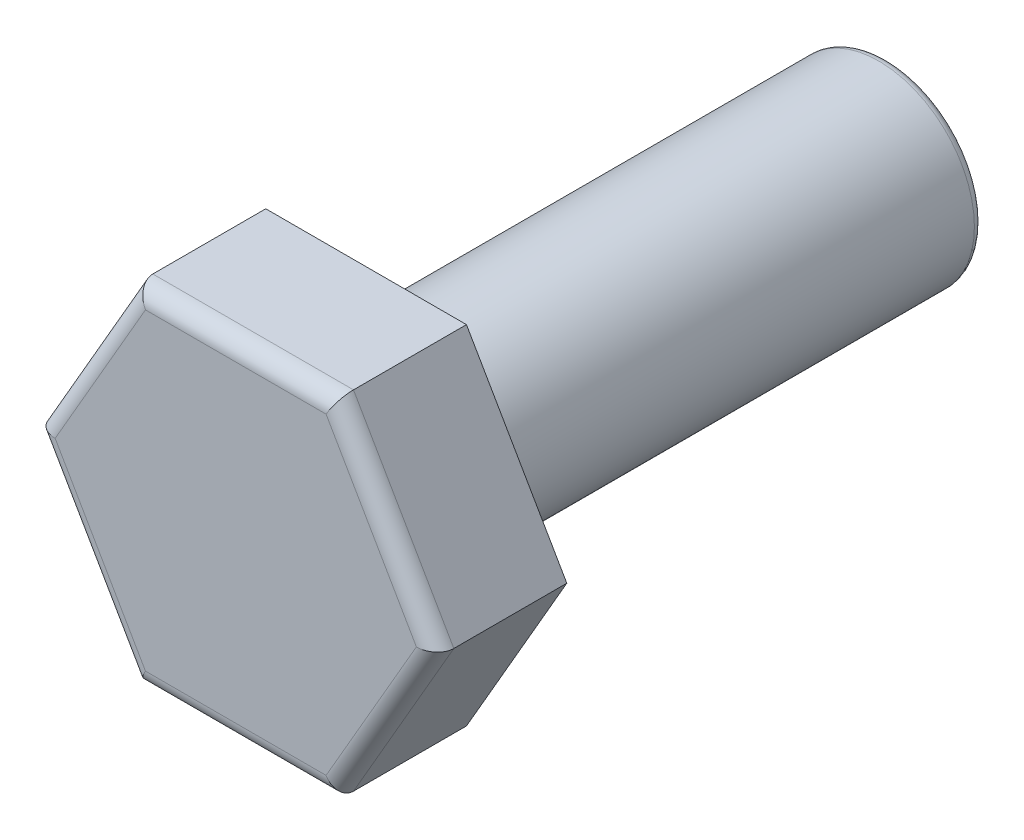
ISO-10303-21;
HEADER;
FILE_DESCRIPTION(('STEP AP214'),'2;1');
FILE_NAME('part.step','',(''),(''),'','','');
FILE_SCHEMA(('AUTOMOTIVE_DESIGN { 1 0 10303 214 1 1 1 1 }'));
ENDSEC;
DATA;
#1=APPLICATION_CONTEXT('core data for automotive mechanical design processes');
#2=APPLICATION_PROTOCOL_DEFINITION('international standard','automotive_design',2000,#1);
#3=PRODUCT_CONTEXT('',#1,'mechanical');
#4=PRODUCT('Part','Part','',(#3));
#5=PRODUCT_RELATED_PRODUCT_CATEGORY('part','',(#4));
#6=PRODUCT_DEFINITION_FORMATION('','',#4);
#7=PRODUCT_DEFINITION_CONTEXT('part definition',#1,'design');
#8=PRODUCT_DEFINITION('design','',#6,#7);
#9=PRODUCT_DEFINITION_SHAPE('','',#8);
#10=(LENGTH_UNIT() NAMED_UNIT(*) SI_UNIT(.MILLI.,.METRE.));
#11=(NAMED_UNIT(*) PLANE_ANGLE_UNIT() SI_UNIT($,.RADIAN.));
#12=(NAMED_UNIT(*) SI_UNIT($,.STERADIAN.) SOLID_ANGLE_UNIT());
#13=UNCERTAINTY_MEASURE_WITH_UNIT(LENGTH_MEASURE(1.E-05),#10,'distance_accuracy_value','');
#14=(GEOMETRIC_REPRESENTATION_CONTEXT(3) GLOBAL_UNCERTAINTY_ASSIGNED_CONTEXT((#13)) GLOBAL_UNIT_ASSIGNED_CONTEXT((#10,
#11,#12)) REPRESENTATION_CONTEXT('',''));
#15=CARTESIAN_POINT('',(0.,0.,0.));
#16=DIRECTION('',(0.,0.,1.));
#17=DIRECTION('',(1.,0.,0.));
#18=AXIS2_PLACEMENT_3D('',#15,#16,#17);
#19=CARTESIAN_POINT('',(0.,0.,75.));
#20=DIRECTION('',(0.,0.,-1.));
#21=DIRECTION('',(-1.,0.,0.));
#22=AXIS2_PLACEMENT_3D('',#19,#20,#21);
#23=CYLINDRICAL_SURFACE('',#22,11.);
#24=CARTESIAN_POINT('',(0.,0.,1.));
#25=DIRECTION('',(0.,0.,1.));
#26=DIRECTION('',(1.,0.,0.));
#27=AXIS2_PLACEMENT_3D('',#24,#25,#26);
#28=CIRCLE('',#27,11.);
#29=CARTESIAN_POINT('',(11.,0.,1.));
#30=VERTEX_POINT('',#29);
#31=EDGE_CURVE('E42',#30,#30,#28,.T.);
#32=ORIENTED_EDGE('',*,*,#31,.T.);
#33=EDGE_LOOP('',(#32));
#34=FACE_BOUND('',#33,.T.);
#35=CARTESIAN_POINT('',(0.,0.,60.));
#36=DIRECTION('',(0.,0.,1.));
#37=DIRECTION('',(1.,0.,0.));
#38=AXIS2_PLACEMENT_3D('',#35,#36,#37);
#39=CIRCLE('',#38,11.);
#40=CARTESIAN_POINT('',(11.,0.,60.));
#41=VERTEX_POINT('',#40);
#42=EDGE_CURVE('E149',#41,#41,#39,.T.);
#43=ORIENTED_EDGE('',*,*,#42,.F.);
#44=EDGE_LOOP('',(#43));
#45=FACE_BOUND('',#44,.T.);
#46=ADVANCED_FACE('F34',(#34,#45),#23,.T.);
#47=CARTESIAN_POINT('',(0.,0.,0.));
#48=DIRECTION('',(0.,0.,1.));
#49=DIRECTION('',(1.,0.,0.));
#50=AXIS2_PLACEMENT_3D('',#47,#48,#49);
#51=PLANE('',#50);
#52=CARTESIAN_POINT('',(0.,0.,0.));
#53=DIRECTION('',(0.,0.,1.));
#54=DIRECTION('',(1.,0.,0.));
#55=AXIS2_PLACEMENT_3D('',#52,#53,#54);
#56=CIRCLE('',#55,10.);
#57=CARTESIAN_POINT('',(10.,0.,0.));
#58=VERTEX_POINT('',#57);
#59=EDGE_CURVE('E11',#58,#58,#56,.F.);
#60=ORIENTED_EDGE('',*,*,#59,.T.);
#61=EDGE_LOOP('',(#60));
#62=FACE_BOUND('',#61,.T.);
#63=ADVANCED_FACE('F208',(#62),#51,.F.);
#64=CARTESIAN_POINT('',(0.,0.,60.));
#65=DIRECTION('',(0.,0.,1.));
#66=DIRECTION('',(1.,0.,0.));
#67=AXIS2_PLACEMENT_3D('',#64,#65,#66);
#68=PLANE('',#67);
#69=DIRECTION('',(1.,0.,0.));
#70=VECTOR('',#69,1.);
#71=CARTESIAN_POINT('',(-11.5470053837925,-20.,60.));
#72=LINE('',#71,#70);
#73=CARTESIAN_POINT('',(-11.5470053837925,-20.,60.));
#74=VERTEX_POINT('',#73);
#75=CARTESIAN_POINT('',(11.5470053837925,-20.,60.));
#76=VERTEX_POINT('',#75);
#77=EDGE_CURVE('E125',#74,#76,#72,.T.);
#78=ORIENTED_EDGE('',*,*,#77,.F.);
#79=DIRECTION('',(0.5,-0.866025403784439,0.));
#80=VECTOR('',#79,1.);
#81=CARTESIAN_POINT('',(-23.094010767585,0.,60.));
#82=LINE('',#81,#80);
#83=CARTESIAN_POINT('',(-23.094010767585,0.,60.));
#84=VERTEX_POINT('',#83);
#85=EDGE_CURVE('E117',#84,#74,#82,.T.);
#86=ORIENTED_EDGE('',*,*,#85,.F.);
#87=DIRECTION('',(-0.5,-0.866025403784438,0.));
#88=VECTOR('',#87,1.);
#89=CARTESIAN_POINT('',(-11.5470053837925,20.,60.));
#90=LINE('',#89,#88);
#91=CARTESIAN_POINT('',(-11.5470053837925,20.,60.));
#92=VERTEX_POINT('',#91);
#93=EDGE_CURVE('E144',#92,#84,#90,.T.);
#94=ORIENTED_EDGE('',*,*,#93,.F.);
#95=DIRECTION('',(-1.,0.,0.));
#96=VECTOR('',#95,1.);
#97=CARTESIAN_POINT('',(11.5470053837925,20.,60.));
#98=LINE('',#97,#96);
#99=CARTESIAN_POINT('',(11.5470053837925,20.,60.));
#100=VERTEX_POINT('',#99);
#101=EDGE_CURVE('E141',#100,#92,#98,.T.);
#102=ORIENTED_EDGE('',*,*,#101,.F.);
#103=DIRECTION('',(-0.5,0.866025403784439,0.));
#104=VECTOR('',#103,1.);
#105=CARTESIAN_POINT('',(23.094010767585,0.,60.));
#106=LINE('',#105,#104);
#107=CARTESIAN_POINT('',(23.094010767585,0.,60.));
#108=VERTEX_POINT('',#107);
#109=EDGE_CURVE('E129',#108,#100,#106,.T.);
#110=ORIENTED_EDGE('',*,*,#109,.F.);
#111=DIRECTION('',(0.5,0.866025403784438,0.));
#112=VECTOR('',#111,1.);
#113=CARTESIAN_POINT('',(11.5470053837925,-20.,60.));
#114=LINE('',#113,#112);
#115=EDGE_CURVE('E111',#76,#108,#114,.T.);
#116=ORIENTED_EDGE('',*,*,#115,.F.);
#117=EDGE_LOOP('',(#78,#86,#94,#102,#110,#116));
#118=FACE_BOUND('',#117,.T.);
#119=ORIENTED_EDGE('',*,*,#42,.T.);
#120=EDGE_LOOP('',(#119));
#121=FACE_BOUND('',#120,.T.);
#122=ADVANCED_FACE('F122',(#118,#121),#68,.F.);
#123=CARTESIAN_POINT('',(-11.5470053837925,-20.,60.));
#124=DIRECTION('',(0.,-1.,0.));
#125=DIRECTION('',(1.,0.,0.));
#126=AXIS2_PLACEMENT_3D('',#123,#124,#125);
#127=PLANE('',#126);
#128=DIRECTION('',(0.,0.,1.));
#129=VECTOR('',#128,1.);
#130=CARTESIAN_POINT('',(11.5470053837925,-20.,60.));
#131=LINE('',#130,#129);
#132=CARTESIAN_POINT('',(11.5470053837925,-20.,73.));
#133=VERTEX_POINT('',#132);
#134=EDGE_CURVE('E107',#76,#133,#131,.T.);
#135=ORIENTED_EDGE('',*,*,#134,.T.);
#136=DIRECTION('',(1.,0.,0.));
#137=VECTOR('',#136,1.);
#138=CARTESIAN_POINT('',(-11.5470053837925,-20.,73.));
#139=LINE('',#138,#137);
#140=CARTESIAN_POINT('',(-11.5470053837925,-20.,73.));
#141=VERTEX_POINT('',#140);
#142=EDGE_CURVE('E173',#133,#141,#139,.F.);
#143=ORIENTED_EDGE('',*,*,#142,.T.);
#144=DIRECTION('',(0.,0.,1.));
#145=VECTOR('',#144,1.);
#146=CARTESIAN_POINT('',(-11.5470053837925,-20.,60.));
#147=LINE('',#146,#145);
#148=EDGE_CURVE('E133',#74,#141,#147,.T.);
#149=ORIENTED_EDGE('',*,*,#148,.F.);
#150=ORIENTED_EDGE('',*,*,#77,.T.);
#151=EDGE_LOOP('',(#135,#143,#149,#150));
#152=FACE_BOUND('',#151,.T.);
#153=ADVANCED_FACE('F131',(#152),#127,.T.);
#154=CARTESIAN_POINT('',(-23.094010767585,0.,60.));
#155=DIRECTION('',(-0.866025403784439,-0.5,0.));
#156=DIRECTION('',(0.5,-0.866025403784439,0.));
#157=AXIS2_PLACEMENT_3D('',#154,#155,#156);
#158=PLANE('',#157);
#159=ORIENTED_EDGE('',*,*,#148,.T.);
#160=DIRECTION('',(0.5,-0.866025403784439,0.));
#161=VECTOR('',#160,1.);
#162=CARTESIAN_POINT('',(-23.094010767585,0.,73.));
#163=LINE('',#162,#161);
#164=CARTESIAN_POINT('',(-23.094010767585,0.,73.));
#165=VERTEX_POINT('',#164);
#166=EDGE_CURVE('E175',#141,#165,#163,.F.);
#167=ORIENTED_EDGE('',*,*,#166,.T.);
#168=DIRECTION('',(0.,0.,1.));
#169=VECTOR('',#168,1.);
#170=CARTESIAN_POINT('',(-23.094010767585,0.,60.));
#171=LINE('',#170,#169);
#172=EDGE_CURVE('E150',#84,#165,#171,.T.);
#173=ORIENTED_EDGE('',*,*,#172,.F.);
#174=ORIENTED_EDGE('',*,*,#85,.T.);
#175=EDGE_LOOP('',(#159,#167,#173,#174));
#176=FACE_BOUND('',#175,.T.);
#177=ADVANCED_FACE('F256',(#176),#158,.T.);
#178=CARTESIAN_POINT('',(-11.5470053837925,20.,60.));
#179=DIRECTION('',(-0.866025403784438,0.5,0.));
#180=DIRECTION('',(-0.5,-0.866025403784439,0.));
#181=AXIS2_PLACEMENT_3D('',#178,#179,#180);
#182=PLANE('',#181);
#183=ORIENTED_EDGE('',*,*,#172,.T.);
#184=DIRECTION('',(-0.5,-0.866025403784439,0.));
#185=VECTOR('',#184,1.);
#186=CARTESIAN_POINT('',(-11.5470053837925,20.,73.));
#187=LINE('',#186,#185);
#188=CARTESIAN_POINT('',(-11.5470053837925,20.,73.));
#189=VERTEX_POINT('',#188);
#190=EDGE_CURVE('E57',#165,#189,#187,.F.);
#191=ORIENTED_EDGE('',*,*,#190,.T.);
#192=DIRECTION('',(0.,0.,1.));
#193=VECTOR('',#192,1.);
#194=CARTESIAN_POINT('',(-11.5470053837925,20.,60.));
#195=LINE('',#194,#193);
#196=EDGE_CURVE('E152',#92,#189,#195,.T.);
#197=ORIENTED_EDGE('',*,*,#196,.F.);
#198=ORIENTED_EDGE('',*,*,#93,.T.);
#199=EDGE_LOOP('',(#183,#191,#197,#198));
#200=FACE_BOUND('',#199,.T.);
#201=ADVANCED_FACE('F260',(#200),#182,.T.);
#202=CARTESIAN_POINT('',(11.5470053837925,20.,60.));
#203=DIRECTION('',(0.,1.,0.));
#204=DIRECTION('',(0.,0.,1.));
#205=AXIS2_PLACEMENT_3D('',#202,#203,#204);
#206=PLANE('',#205);
#207=ORIENTED_EDGE('',*,*,#196,.T.);
#208=DIRECTION('',(-1.,0.,0.));
#209=VECTOR('',#208,1.);
#210=CARTESIAN_POINT('',(11.5470053837925,20.,73.));
#211=LINE('',#210,#209);
#212=CARTESIAN_POINT('',(11.5470053837925,20.,73.));
#213=VERTEX_POINT('',#212);
#214=EDGE_CURVE('E49',#189,#213,#211,.F.);
#215=ORIENTED_EDGE('',*,*,#214,.T.);
#216=DIRECTION('',(0.,0.,1.));
#217=VECTOR('',#216,1.);
#218=CARTESIAN_POINT('',(11.5470053837925,20.,60.));
#219=LINE('',#218,#217);
#220=EDGE_CURVE('E154',#100,#213,#219,.T.);
#221=ORIENTED_EDGE('',*,*,#220,.F.);
#222=ORIENTED_EDGE('',*,*,#101,.T.);
#223=EDGE_LOOP('',(#207,#215,#221,#222));
#224=FACE_BOUND('',#223,.T.);
#225=ADVANCED_FACE('F259',(#224),#206,.T.);
#226=CARTESIAN_POINT('',(23.094010767585,0.,60.));
#227=DIRECTION('',(0.866025403784439,0.5,0.));
#228=DIRECTION('',(-0.5,0.866025403784439,0.));
#229=AXIS2_PLACEMENT_3D('',#226,#227,#228);
#230=PLANE('',#229);
#231=ORIENTED_EDGE('',*,*,#220,.T.);
#232=DIRECTION('',(-0.5,0.866025403784439,0.));
#233=VECTOR('',#232,1.);
#234=CARTESIAN_POINT('',(23.094010767585,0.,73.));
#235=LINE('',#234,#233);
#236=CARTESIAN_POINT('',(23.094010767585,0.,73.));
#237=VERTEX_POINT('',#236);
#238=EDGE_CURVE('E179',#213,#237,#235,.F.);
#239=ORIENTED_EDGE('',*,*,#238,.T.);
#240=DIRECTION('',(0.,0.,1.));
#241=VECTOR('',#240,1.);
#242=CARTESIAN_POINT('',(23.094010767585,0.,60.));
#243=LINE('',#242,#241);
#244=EDGE_CURVE('E116',#108,#237,#243,.T.);
#245=ORIENTED_EDGE('',*,*,#244,.F.);
#246=ORIENTED_EDGE('',*,*,#109,.T.);
#247=EDGE_LOOP('',(#231,#239,#245,#246));
#248=FACE_BOUND('',#247,.T.);
#249=ADVANCED_FACE('F248',(#248),#230,.T.);
#250=CARTESIAN_POINT('',(11.5470053837925,-20.,60.));
#251=DIRECTION('',(0.866025403784438,-0.5,0.));
#252=DIRECTION('',(0.5,0.866025403784439,0.));
#253=AXIS2_PLACEMENT_3D('',#250,#251,#252);
#254=PLANE('',#253);
#255=ORIENTED_EDGE('',*,*,#244,.T.);
#256=DIRECTION('',(0.5,0.866025403784439,0.));
#257=VECTOR('',#256,1.);
#258=CARTESIAN_POINT('',(11.5470053837925,-20.,73.));
#259=LINE('',#258,#257);
#260=EDGE_CURVE('E113',#237,#133,#259,.F.);
#261=ORIENTED_EDGE('',*,*,#260,.T.);
#262=ORIENTED_EDGE('',*,*,#134,.F.);
#263=ORIENTED_EDGE('',*,*,#115,.T.);
#264=EDGE_LOOP('',(#255,#261,#262,#263));
#265=FACE_BOUND('',#264,.T.);
#266=ADVANCED_FACE('F110',(#265),#254,.T.);
#267=CARTESIAN_POINT('',(0.,0.,75.));
#268=DIRECTION('',(0.,0.,1.));
#269=DIRECTION('',(1.,0.,0.));
#270=AXIS2_PLACEMENT_3D('',#267,#268,#269);
#271=PLANE('',#270);
#272=DIRECTION('',(1.,0.,0.));
#273=VECTOR('',#272,1.);
#274=CARTESIAN_POINT('',(0.,-18.,75.));
#275=LINE('',#274,#273);
#276=CARTESIAN_POINT('',(-10.3923048454133,-18.,75.));
#277=VERTEX_POINT('',#276);
#278=CARTESIAN_POINT('',(10.3923048454133,-18.,75.));
#279=VERTEX_POINT('',#278);
#280=EDGE_CURVE('E167',#277,#279,#275,.T.);
#281=ORIENTED_EDGE('',*,*,#280,.T.);
#282=DIRECTION('',(0.5,0.866025403784439,0.));
#283=VECTOR('',#282,1.);
#284=CARTESIAN_POINT('',(15.5884572681199,-9.,75.));
#285=LINE('',#284,#283);
#286=CARTESIAN_POINT('',(20.7846096908265,0.,75.));
#287=VERTEX_POINT('',#286);
#288=EDGE_CURVE('E169',#279,#287,#285,.T.);
#289=ORIENTED_EDGE('',*,*,#288,.T.);
#290=DIRECTION('',(-0.5,0.866025403784439,0.));
#291=VECTOR('',#290,1.);
#292=CARTESIAN_POINT('',(15.5884572681199,9.,75.));
#293=LINE('',#292,#291);
#294=CARTESIAN_POINT('',(10.3923048454133,18.,75.));
#295=VERTEX_POINT('',#294);
#296=EDGE_CURVE('E159',#287,#295,#293,.T.);
#297=ORIENTED_EDGE('',*,*,#296,.T.);
#298=DIRECTION('',(-1.,0.,0.));
#299=VECTOR('',#298,1.);
#300=CARTESIAN_POINT('',(0.,18.,75.));
#301=LINE('',#300,#299);
#302=CARTESIAN_POINT('',(-10.3923048454133,18.,75.));
#303=VERTEX_POINT('',#302);
#304=EDGE_CURVE('E161',#295,#303,#301,.T.);
#305=ORIENTED_EDGE('',*,*,#304,.T.);
#306=DIRECTION('',(-0.5,-0.866025403784439,0.));
#307=VECTOR('',#306,1.);
#308=CARTESIAN_POINT('',(-15.5884572681199,9.,75.));
#309=LINE('',#308,#307);
#310=CARTESIAN_POINT('',(-20.7846096908265,0.,75.));
#311=VERTEX_POINT('',#310);
#312=EDGE_CURVE('E163',#303,#311,#309,.T.);
#313=ORIENTED_EDGE('',*,*,#312,.T.);
#314=DIRECTION('',(0.5,-0.866025403784439,0.));
#315=VECTOR('',#314,1.);
#316=CARTESIAN_POINT('',(-15.5884572681199,-8.99999999999999,75.));
#317=LINE('',#316,#315);
#318=EDGE_CURVE('E165',#311,#277,#317,.T.);
#319=ORIENTED_EDGE('',*,*,#318,.T.);
#320=EDGE_LOOP('',(#281,#289,#297,#305,#313,#319));
#321=FACE_BOUND('',#320,.T.);
#322=ADVANCED_FACE('F233',(#321),#271,.T.);
#323=CARTESIAN_POINT('',(-15.5884572681199,9.,73.));
#324=DIRECTION('',(-0.5,-0.866025403784439,0.));
#325=DIRECTION('',(0.866025403784438,-0.5,0.));
#326=AXIS2_PLACEMENT_3D('',#323,#324,#325);
#327=CYLINDRICAL_SURFACE('',#326,2.);
#328=CARTESIAN_POINT('',(-10.3923048454132,18.,73.));
#329=DIRECTION('',(-0.866025403784439,-0.5,0.));
#330=DIRECTION('',(-0.5,0.866025403784439,0.));
#331=AXIS2_PLACEMENT_3D('',#328,#329,#330);
#332=ELLIPSE('',#331,2.3094010767585,2.);
#333=EDGE_CURVE('E137',#189,#303,#332,.F.);
#334=ORIENTED_EDGE('',*,*,#333,.F.);
#335=ORIENTED_EDGE('',*,*,#190,.F.);
#336=CARTESIAN_POINT('',(-20.7846096908265,0.,73.));
#337=DIRECTION('',(0.,-1.,0.));
#338=DIRECTION('',(-1.,0.,0.));
#339=AXIS2_PLACEMENT_3D('',#336,#337,#338);
#340=ELLIPSE('',#339,2.3094010767585,2.);
#341=EDGE_CURVE('E134',#311,#165,#340,.T.);
#342=ORIENTED_EDGE('',*,*,#341,.F.);
#343=ORIENTED_EDGE('',*,*,#312,.F.);
#344=EDGE_LOOP('',(#334,#335,#342,#343));
#345=FACE_BOUND('',#344,.T.);
#346=ADVANCED_FACE('F230',(#345),#327,.T.);
#347=CARTESIAN_POINT('',(-15.5884572681199,-8.99999999999999,73.));
#348=DIRECTION('',(0.5,-0.866025403784439,0.));
#349=DIRECTION('',(0.866025403784439,0.5,0.));
#350=AXIS2_PLACEMENT_3D('',#347,#348,#349);
#351=CYLINDRICAL_SURFACE('',#350,2.);
#352=ORIENTED_EDGE('',*,*,#341,.T.);
#353=ORIENTED_EDGE('',*,*,#166,.F.);
#354=CARTESIAN_POINT('',(-10.3923048454133,-18.,73.));
#355=DIRECTION('',(0.866025403784439,-0.5,0.));
#356=DIRECTION('',(-0.5,-0.866025403784439,0.));
#357=AXIS2_PLACEMENT_3D('',#354,#355,#356);
#358=ELLIPSE('',#357,2.3094010767585,2.);
#359=EDGE_CURVE('E188',#277,#141,#358,.T.);
#360=ORIENTED_EDGE('',*,*,#359,.F.);
#361=ORIENTED_EDGE('',*,*,#318,.F.);
#362=EDGE_LOOP('',(#352,#353,#360,#361));
#363=FACE_BOUND('',#362,.T.);
#364=ADVANCED_FACE('F227',(#363),#351,.T.);
#365=CARTESIAN_POINT('',(0.,18.,73.));
#366=DIRECTION('',(-1.,0.,0.));
#367=DIRECTION('',(0.,0.,1.));
#368=AXIS2_PLACEMENT_3D('',#365,#366,#367);
#369=CYLINDRICAL_SURFACE('',#368,2.);
#370=ORIENTED_EDGE('',*,*,#333,.T.);
#371=ORIENTED_EDGE('',*,*,#304,.F.);
#372=CARTESIAN_POINT('',(10.3923048454133,18.,73.));
#373=DIRECTION('',(-0.866025403784439,0.5,0.));
#374=DIRECTION('',(0.5,0.866025403784439,0.));
#375=AXIS2_PLACEMENT_3D('',#372,#373,#374);
#376=ELLIPSE('',#375,2.3094010767585,2.);
#377=EDGE_CURVE('E185',#213,#295,#376,.F.);
#378=ORIENTED_EDGE('',*,*,#377,.F.);
#379=ORIENTED_EDGE('',*,*,#214,.F.);
#380=EDGE_LOOP('',(#370,#371,#378,#379));
#381=FACE_BOUND('',#380,.T.);
#382=ADVANCED_FACE('F223',(#381),#369,.T.);
#383=CARTESIAN_POINT('',(0.,-18.,73.));
#384=DIRECTION('',(1.,0.,0.));
#385=DIRECTION('',(0.,1.,0.));
#386=AXIS2_PLACEMENT_3D('',#383,#384,#385);
#387=CYLINDRICAL_SURFACE('',#386,2.);
#388=ORIENTED_EDGE('',*,*,#359,.T.);
#389=ORIENTED_EDGE('',*,*,#142,.F.);
#390=CARTESIAN_POINT('',(10.3923048454133,-18.,73.));
#391=DIRECTION('',(0.866025403784439,0.5,0.));
#392=DIRECTION('',(0.5,-0.866025403784439,0.));
#393=AXIS2_PLACEMENT_3D('',#390,#391,#392);
#394=ELLIPSE('',#393,2.3094010767585,2.);
#395=EDGE_CURVE('E183',#279,#133,#394,.T.);
#396=ORIENTED_EDGE('',*,*,#395,.F.);
#397=ORIENTED_EDGE('',*,*,#280,.F.);
#398=EDGE_LOOP('',(#388,#389,#396,#397));
#399=FACE_BOUND('',#398,.T.);
#400=ADVANCED_FACE('F219',(#399),#387,.T.);
#401=CARTESIAN_POINT('',(15.5884572681199,8.99999999999999,73.));
#402=DIRECTION('',(-0.5,0.866025403784439,0.));
#403=DIRECTION('',(-0.866025403784439,-0.5,0.));
#404=AXIS2_PLACEMENT_3D('',#401,#402,#403);
#405=CYLINDRICAL_SURFACE('',#404,2.);
#406=ORIENTED_EDGE('',*,*,#377,.T.);
#407=ORIENTED_EDGE('',*,*,#296,.F.);
#408=CARTESIAN_POINT('',(20.7846096908265,0.,73.));
#409=DIRECTION('',(0.,1.,0.));
#410=DIRECTION('',(-1.,0.,0.));
#411=AXIS2_PLACEMENT_3D('',#408,#409,#410);
#412=ELLIPSE('',#411,2.3094010767585,2.);
#413=EDGE_CURVE('E181',#237,#287,#412,.F.);
#414=ORIENTED_EDGE('',*,*,#413,.F.);
#415=ORIENTED_EDGE('',*,*,#238,.F.);
#416=EDGE_LOOP('',(#406,#407,#414,#415));
#417=FACE_BOUND('',#416,.T.);
#418=ADVANCED_FACE('F203',(#417),#405,.T.);
#419=CARTESIAN_POINT('',(15.5884572681199,-9.,73.));
#420=DIRECTION('',(0.5,0.866025403784439,0.));
#421=DIRECTION('',(-0.866025403784438,0.5,0.));
#422=AXIS2_PLACEMENT_3D('',#419,#420,#421);
#423=CYLINDRICAL_SURFACE('',#422,2.);
#424=ORIENTED_EDGE('',*,*,#395,.T.);
#425=ORIENTED_EDGE('',*,*,#260,.F.);
#426=ORIENTED_EDGE('',*,*,#413,.T.);
#427=ORIENTED_EDGE('',*,*,#288,.F.);
#428=EDGE_LOOP('',(#424,#425,#426,#427));
#429=FACE_BOUND('',#428,.T.);
#430=ADVANCED_FACE('F198',(#429),#423,.T.);
#431=CARTESIAN_POINT('',(0.,0.,1.));
#432=DIRECTION('',(0.,0.,1.));
#433=DIRECTION('',(1.,0.,0.));
#434=AXIS2_PLACEMENT_3D('',#431,#432,#433);
#435=TOROIDAL_SURFACE('',#434,10.,1.);
#436=ORIENTED_EDGE('',*,*,#59,.F.);
#437=EDGE_LOOP('',(#436));
#438=FACE_BOUND('',#437,.T.);
#439=ORIENTED_EDGE('',*,*,#31,.F.);
#440=EDGE_LOOP('',(#439));
#441=FACE_BOUND('',#440,.T.);
#442=ADVANCED_FACE('F36',(#438,#441),#435,.T.);
#443=CLOSED_SHELL('',(#46,#63,#122,#153,#177,#201,#225,#249,#266,#322,#346,#364,#382,#400,#418,
#430,#442));
#444=MANIFOLD_SOLID_BREP('B2',#443);
#445=ADVANCED_BREP_SHAPE_REPRESENTATION('',(#18,#444),#14);
#446=SHAPE_DEFINITION_REPRESENTATION(#9,#445);
ENDSEC;
END-ISO-10303-21;
